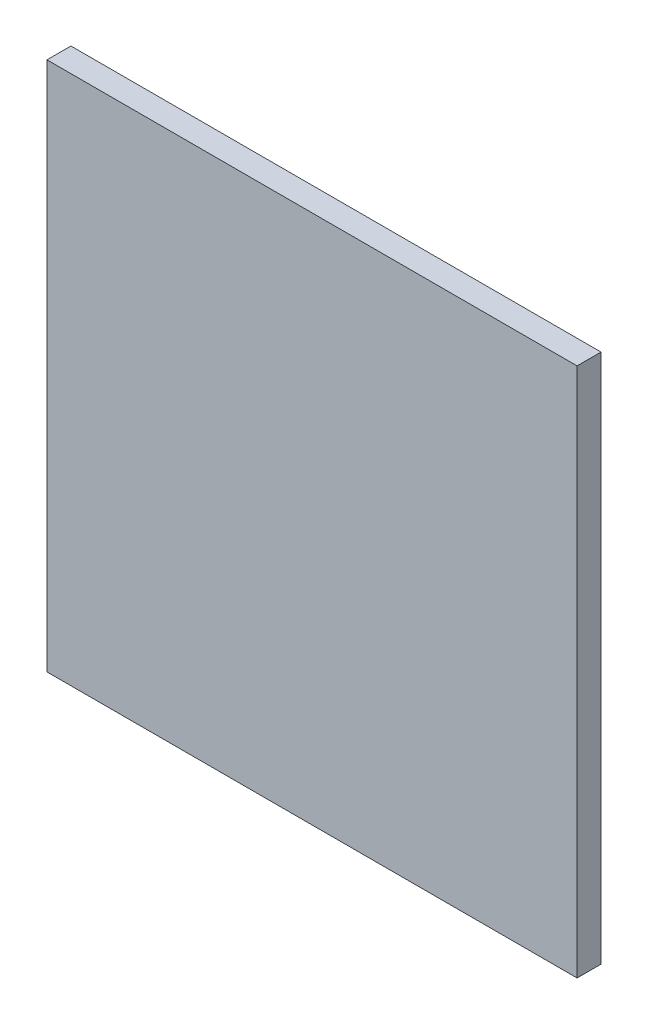
ISO-10303-21;
HEADER;
FILE_DESCRIPTION(('STEP AP214'),'2;1');
FILE_NAME('part.step','',(''),(''),'','','');
FILE_SCHEMA(('AUTOMOTIVE_DESIGN { 1 0 10303 214 1 1 1 1 }'));
ENDSEC;
DATA;
#1=APPLICATION_CONTEXT('core data for automotive mechanical design processes');
#2=APPLICATION_PROTOCOL_DEFINITION('international standard','automotive_design',2000,#1);
#3=PRODUCT_CONTEXT('',#1,'mechanical');
#4=PRODUCT('Part','Part','',(#3));
#5=PRODUCT_RELATED_PRODUCT_CATEGORY('part','',(#4));
#6=PRODUCT_DEFINITION_FORMATION('','',#4);
#7=PRODUCT_DEFINITION_CONTEXT('part definition',#1,'design');
#8=PRODUCT_DEFINITION('design','',#6,#7);
#9=PRODUCT_DEFINITION_SHAPE('','',#8);
#10=(LENGTH_UNIT() NAMED_UNIT(*) SI_UNIT(.MILLI.,.METRE.));
#11=(NAMED_UNIT(*) PLANE_ANGLE_UNIT() SI_UNIT($,.RADIAN.));
#12=(NAMED_UNIT(*) SI_UNIT($,.STERADIAN.) SOLID_ANGLE_UNIT());
#13=UNCERTAINTY_MEASURE_WITH_UNIT(LENGTH_MEASURE(1.E-05),#10,'distance_accuracy_value','');
#14=(GEOMETRIC_REPRESENTATION_CONTEXT(3) GLOBAL_UNCERTAINTY_ASSIGNED_CONTEXT((#13)) GLOBAL_UNIT_ASSIGNED_CONTEXT((#10,
#11,#12)) REPRESENTATION_CONTEXT('',''));
#15=CARTESIAN_POINT('',(0.,0.,0.));
#16=DIRECTION('',(0.,0.,1.));
#17=DIRECTION('',(1.,0.,0.));
#18=AXIS2_PLACEMENT_3D('',#15,#16,#17);
#19=CARTESIAN_POINT('',(-155.,155.,14.));
#20=DIRECTION('',(0.,0.,1.));
#21=DIRECTION('',(1.,0.,0.));
#22=AXIS2_PLACEMENT_3D('',#19,#20,#21);
#23=PLANE('',#22);
#24=DIRECTION('',(0.,-1.,0.));
#25=VECTOR('',#24,1.);
#26=CARTESIAN_POINT('',(-155.,155.,14.));
#27=LINE('',#26,#25);
#28=CARTESIAN_POINT('',(-155.,155.,14.));
#29=VERTEX_POINT('',#28);
#30=CARTESIAN_POINT('',(-155.,-155.,14.));
#31=VERTEX_POINT('',#30);
#32=EDGE_CURVE('E98',#29,#31,#27,.T.);
#33=ORIENTED_EDGE('',*,*,#32,.T.);
#34=DIRECTION('',(1.,0.,0.));
#35=VECTOR('',#34,1.);
#36=CARTESIAN_POINT('',(-135.,-155.,14.));
#37=LINE('',#36,#35);
#38=CARTESIAN_POINT('',(155.,-155.,14.));
#39=VERTEX_POINT('',#38);
#40=EDGE_CURVE('E81',#31,#39,#37,.T.);
#41=ORIENTED_EDGE('',*,*,#40,.T.);
#42=DIRECTION('',(0.,1.,0.));
#43=VECTOR('',#42,1.);
#44=CARTESIAN_POINT('',(155.,135.,14.));
#45=LINE('',#44,#43);
#46=CARTESIAN_POINT('',(155.,155.,14.));
#47=VERTEX_POINT('',#46);
#48=EDGE_CURVE('E79',#39,#47,#45,.T.);
#49=ORIENTED_EDGE('',*,*,#48,.T.);
#50=DIRECTION('',(-1.,0.,0.));
#51=VECTOR('',#50,1.);
#52=CARTESIAN_POINT('',(-155.,155.,14.));
#53=LINE('',#52,#51);
#54=EDGE_CURVE('E51',#47,#29,#53,.T.);
#55=ORIENTED_EDGE('',*,*,#54,.T.);
#56=EDGE_LOOP('',(#33,#41,#49,#55));
#57=FACE_BOUND('',#56,.T.);
#58=ADVANCED_FACE('F34',(#57),#23,.T.);
#59=CARTESIAN_POINT('',(-155.,155.,0.));
#60=DIRECTION('',(0.,0.,1.));
#61=DIRECTION('',(1.,0.,0.));
#62=AXIS2_PLACEMENT_3D('',#59,#60,#61);
#63=PLANE('',#62);
#64=DIRECTION('',(0.,-1.,0.));
#65=VECTOR('',#64,1.);
#66=CARTESIAN_POINT('',(-155.,155.,0.));
#67=LINE('',#66,#65);
#68=CARTESIAN_POINT('',(-155.,155.,0.));
#69=VERTEX_POINT('',#68);
#70=CARTESIAN_POINT('',(-155.,-155.,0.));
#71=VERTEX_POINT('',#70);
#72=EDGE_CURVE('E91',#69,#71,#67,.T.);
#73=ORIENTED_EDGE('',*,*,#72,.F.);
#74=DIRECTION('',(-1.,0.,0.));
#75=VECTOR('',#74,1.);
#76=CARTESIAN_POINT('',(-155.,155.,0.));
#77=LINE('',#76,#75);
#78=CARTESIAN_POINT('',(155.,155.,0.));
#79=VERTEX_POINT('',#78);
#80=EDGE_CURVE('E100',#79,#69,#77,.T.);
#81=ORIENTED_EDGE('',*,*,#80,.F.);
#82=DIRECTION('',(0.,1.,0.));
#83=VECTOR('',#82,1.);
#84=CARTESIAN_POINT('',(155.,135.,0.));
#85=LINE('',#84,#83);
#86=CARTESIAN_POINT('',(155.,-155.,0.));
#87=VERTEX_POINT('',#86);
#88=EDGE_CURVE('E71',#87,#79,#85,.T.);
#89=ORIENTED_EDGE('',*,*,#88,.F.);
#90=DIRECTION('',(1.,0.,0.));
#91=VECTOR('',#90,1.);
#92=CARTESIAN_POINT('',(-135.,-155.,0.));
#93=LINE('',#92,#91);
#94=EDGE_CURVE('E63',#71,#87,#93,.T.);
#95=ORIENTED_EDGE('',*,*,#94,.F.);
#96=EDGE_LOOP('',(#73,#81,#89,#95));
#97=FACE_BOUND('',#96,.T.);
#98=ADVANCED_FACE('F107',(#97),#63,.F.);
#99=CARTESIAN_POINT('',(-155.,155.,14.));
#100=DIRECTION('',(1.,0.,0.));
#101=DIRECTION('',(0.,1.,0.));
#102=AXIS2_PLACEMENT_3D('',#99,#100,#101);
#103=PLANE('',#102);
#104=ORIENTED_EDGE('',*,*,#72,.T.);
#105=DIRECTION('',(0.,0.,1.));
#106=VECTOR('',#105,1.);
#107=CARTESIAN_POINT('',(-155.,-155.,0.));
#108=LINE('',#107,#106);
#109=EDGE_CURVE('E92',#71,#31,#108,.T.);
#110=ORIENTED_EDGE('',*,*,#109,.T.);
#111=ORIENTED_EDGE('',*,*,#32,.F.);
#112=DIRECTION('',(0.,0.,-1.));
#113=VECTOR('',#112,1.);
#114=CARTESIAN_POINT('',(-155.,155.,14.));
#115=LINE('',#114,#113);
#116=EDGE_CURVE('E43',#29,#69,#115,.T.);
#117=ORIENTED_EDGE('',*,*,#116,.T.);
#118=EDGE_LOOP('',(#104,#110,#111,#117));
#119=FACE_BOUND('',#118,.T.);
#120=ADVANCED_FACE('F36',(#119),#103,.F.);
#121=CARTESIAN_POINT('',(-135.,-155.,14.));
#122=DIRECTION('',(0.,1.,0.));
#123=DIRECTION('',(0.,0.,1.));
#124=AXIS2_PLACEMENT_3D('',#121,#122,#123);
#125=PLANE('',#124);
#126=ORIENTED_EDGE('',*,*,#94,.T.);
#127=DIRECTION('',(0.,0.,-1.));
#128=VECTOR('',#127,1.);
#129=CARTESIAN_POINT('',(155.,-155.,14.));
#130=LINE('',#129,#128);
#131=EDGE_CURVE('E11',#39,#87,#130,.T.);
#132=ORIENTED_EDGE('',*,*,#131,.F.);
#133=ORIENTED_EDGE('',*,*,#40,.F.);
#134=ORIENTED_EDGE('',*,*,#109,.F.);
#135=EDGE_LOOP('',(#126,#132,#133,#134));
#136=FACE_BOUND('',#135,.T.);
#137=ADVANCED_FACE('F108',(#136),#125,.F.);
#138=CARTESIAN_POINT('',(155.,135.,14.));
#139=DIRECTION('',(-1.,0.,0.));
#140=DIRECTION('',(0.,-1.,0.));
#141=AXIS2_PLACEMENT_3D('',#138,#139,#140);
#142=PLANE('',#141);
#143=ORIENTED_EDGE('',*,*,#88,.T.);
#144=DIRECTION('',(0.,0.,1.));
#145=VECTOR('',#144,1.);
#146=CARTESIAN_POINT('',(155.,155.,0.));
#147=LINE('',#146,#145);
#148=EDGE_CURVE('E86',#79,#47,#147,.T.);
#149=ORIENTED_EDGE('',*,*,#148,.T.);
#150=ORIENTED_EDGE('',*,*,#48,.F.);
#151=ORIENTED_EDGE('',*,*,#131,.T.);
#152=EDGE_LOOP('',(#143,#149,#150,#151));
#153=FACE_BOUND('',#152,.T.);
#154=ADVANCED_FACE('F90',(#153),#142,.F.);
#155=CARTESIAN_POINT('',(-155.,155.,14.));
#156=DIRECTION('',(0.,-1.,0.));
#157=DIRECTION('',(1.,0.,0.));
#158=AXIS2_PLACEMENT_3D('',#155,#156,#157);
#159=PLANE('',#158);
#160=ORIENTED_EDGE('',*,*,#80,.T.);
#161=ORIENTED_EDGE('',*,*,#116,.F.);
#162=ORIENTED_EDGE('',*,*,#54,.F.);
#163=ORIENTED_EDGE('',*,*,#148,.F.);
#164=EDGE_LOOP('',(#160,#161,#162,#163));
#165=FACE_BOUND('',#164,.T.);
#166=ADVANCED_FACE('F85',(#165),#159,.F.);
#167=CLOSED_SHELL('',(#58,#98,#120,#137,#154,#166));
#168=MANIFOLD_SOLID_BREP('B2',#167);
#169=ADVANCED_BREP_SHAPE_REPRESENTATION('',(#18,#168),#14);
#170=SHAPE_DEFINITION_REPRESENTATION(#9,#169);
ENDSEC;
END-ISO-10303-21;
